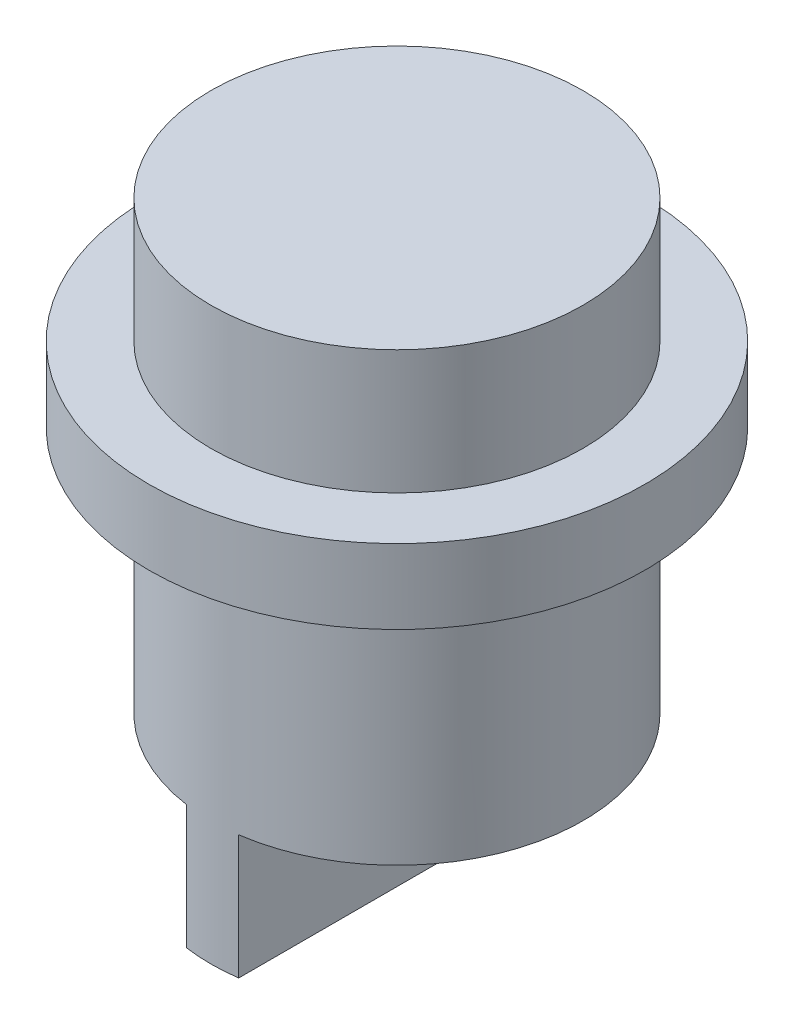
ISO-10303-21;
HEADER;
FILE_DESCRIPTION(('STEP AP214'),'2;1');
FILE_NAME('part.step','',(''),(''),'','','');
FILE_SCHEMA(('AUTOMOTIVE_DESIGN { 1 0 10303 214 1 1 1 1 }'));
ENDSEC;
DATA;
#1=APPLICATION_CONTEXT('core data for automotive mechanical design processes');
#2=APPLICATION_PROTOCOL_DEFINITION('international standard','automotive_design',2000,#1);
#3=PRODUCT_CONTEXT('',#1,'mechanical');
#4=PRODUCT('Part','Part','',(#3));
#5=PRODUCT_RELATED_PRODUCT_CATEGORY('part','',(#4));
#6=PRODUCT_DEFINITION_FORMATION('','',#4);
#7=PRODUCT_DEFINITION_CONTEXT('part definition',#1,'design');
#8=PRODUCT_DEFINITION('design','',#6,#7);
#9=PRODUCT_DEFINITION_SHAPE('','',#8);
#10=(LENGTH_UNIT() NAMED_UNIT(*) SI_UNIT(.MILLI.,.METRE.));
#11=(NAMED_UNIT(*) PLANE_ANGLE_UNIT() SI_UNIT($,.RADIAN.));
#12=(NAMED_UNIT(*) SI_UNIT($,.STERADIAN.) SOLID_ANGLE_UNIT());
#13=UNCERTAINTY_MEASURE_WITH_UNIT(LENGTH_MEASURE(1.E-05),#10,'distance_accuracy_value','');
#14=(GEOMETRIC_REPRESENTATION_CONTEXT(3) GLOBAL_UNCERTAINTY_ASSIGNED_CONTEXT((#13)) GLOBAL_UNIT_ASSIGNED_CONTEXT((#10,
#11,#12)) REPRESENTATION_CONTEXT('',''));
#15=CARTESIAN_POINT('',(0.,0.,0.));
#16=DIRECTION('',(0.,0.,1.));
#17=DIRECTION('',(1.,0.,0.));
#18=AXIS2_PLACEMENT_3D('',#15,#16,#17);
#19=CARTESIAN_POINT('',(0.,0.,0.));
#20=DIRECTION('',(0.,1.,0.));
#21=DIRECTION('',(0.,0.,1.));
#22=AXIS2_PLACEMENT_3D('',#19,#20,#21);
#23=PLANE('',#22);
#24=DIRECTION('',(0.,0.,-1.));
#25=VECTOR('',#24,1.);
#26=CARTESIAN_POINT('',(-1.04813220415567,0.,7.4264001294444));
#27=LINE('',#26,#25);
#28=CARTESIAN_POINT('',(-1.04813220415567,0.,7.4264001294444));
#29=VERTEX_POINT('',#28);
#30=CARTESIAN_POINT('',(-1.04813220415567,0.,-7.4264001294444));
#31=VERTEX_POINT('',#30);
#32=EDGE_CURVE('E56',#29,#31,#27,.T.);
#33=ORIENTED_EDGE('',*,*,#32,.F.);
#34=CARTESIAN_POINT('',(0.,0.,0.));
#35=DIRECTION('',(0.,1.,0.));
#36=DIRECTION('',(0.,0.,1.));
#37=AXIS2_PLACEMENT_3D('',#34,#35,#36);
#38=CIRCLE('',#37,7.5);
#39=EDGE_CURVE('E59',#31,#29,#38,.T.);
#40=ORIENTED_EDGE('',*,*,#39,.F.);
#41=EDGE_LOOP('',(#33,#40));
#42=FACE_BOUND('',#41,.T.);
#43=ADVANCED_FACE('F39',(#42),#23,.F.);
#44=DIRECTION('',(0.,0.,1.));
#45=VECTOR('',#44,1.);
#46=CARTESIAN_POINT('',(1.04813220415567,0.,7.4264001294444));
#47=LINE('',#46,#45);
#48=CARTESIAN_POINT('',(1.04813220415567,0.,-7.4264001294444));
#49=VERTEX_POINT('',#48);
#50=CARTESIAN_POINT('',(1.04813220415567,0.,7.4264001294444));
#51=VERTEX_POINT('',#50);
#52=EDGE_CURVE('E139',#49,#51,#47,.T.);
#53=ORIENTED_EDGE('',*,*,#52,.F.);
#54=EDGE_CURVE('E43',#51,#49,#38,.T.);
#55=ORIENTED_EDGE('',*,*,#54,.F.);
#56=EDGE_LOOP('',(#53,#55));
#57=FACE_BOUND('',#56,.T.);
#58=ADVANCED_FACE('F146',(#57),#23,.F.);
#59=CARTESIAN_POINT('',(0.,10.,0.));
#60=DIRECTION('',(0.,-1.,0.));
#61=DIRECTION('',(0.,0.,-1.));
#62=AXIS2_PLACEMENT_3D('',#59,#60,#61);
#63=CYLINDRICAL_SURFACE('',#62,7.5);
#64=CARTESIAN_POINT('',(0.,10.,0.));
#65=DIRECTION('',(0.,1.,0.));
#66=DIRECTION('',(0.,0.,1.));
#67=AXIS2_PLACEMENT_3D('',#64,#65,#66);
#68=CIRCLE('',#67,7.5);
#69=CARTESIAN_POINT('',(0.,10.,7.5));
#70=VERTEX_POINT('',#69);
#71=EDGE_CURVE('E49',#70,#70,#68,.T.);
#72=ORIENTED_EDGE('',*,*,#71,.F.);
#73=EDGE_LOOP('',(#72));
#74=FACE_BOUND('',#73,.T.);
#75=ORIENTED_EDGE('',*,*,#54,.T.);
#76=DIRECTION('',(0.,1.,0.));
#77=VECTOR('',#76,1.);
#78=CARTESIAN_POINT('',(1.04813220415567,-5.,-7.4264001294444));
#79=LINE('',#78,#77);
#80=CARTESIAN_POINT('',(1.04813220415567,-5.,-7.4264001294444));
#81=VERTEX_POINT('',#80);
#82=EDGE_CURVE('E85',#81,#49,#79,.T.);
#83=ORIENTED_EDGE('',*,*,#82,.F.);
#84=CARTESIAN_POINT('',(0.,-5.,0.));
#85=DIRECTION('',(0.,-1.,0.));
#86=DIRECTION('',(0.,0.,-1.));
#87=AXIS2_PLACEMENT_3D('',#84,#85,#86);
#88=CIRCLE('',#87,7.5);
#89=CARTESIAN_POINT('',(-1.04813220415567,-5.,-7.4264001294444));
#90=VERTEX_POINT('',#89);
#91=EDGE_CURVE('E92',#90,#81,#88,.T.);
#92=ORIENTED_EDGE('',*,*,#91,.F.);
#93=DIRECTION('',(0.,1.,0.));
#94=VECTOR('',#93,1.);
#95=CARTESIAN_POINT('',(-1.04813220415567,-5.,-7.4264001294444));
#96=LINE('',#95,#94);
#97=EDGE_CURVE('E130',#90,#31,#96,.T.);
#98=ORIENTED_EDGE('',*,*,#97,.T.);
#99=ORIENTED_EDGE('',*,*,#39,.T.);
#100=DIRECTION('',(0.,1.,0.));
#101=VECTOR('',#100,1.);
#102=CARTESIAN_POINT('',(-1.04813220415567,-5.,7.4264001294444));
#103=LINE('',#102,#101);
#104=CARTESIAN_POINT('',(-1.04813220415567,-5.,7.4264001294444));
#105=VERTEX_POINT('',#104);
#106=EDGE_CURVE('E112',#105,#29,#103,.T.);
#107=ORIENTED_EDGE('',*,*,#106,.F.);
#108=CARTESIAN_POINT('',(0.,-5.,0.));
#109=DIRECTION('',(0.,-1.,0.));
#110=DIRECTION('',(0.,0.,-1.));
#111=AXIS2_PLACEMENT_3D('',#108,#109,#110);
#112=CIRCLE('',#111,7.5);
#113=CARTESIAN_POINT('',(1.04813220415567,-5.,7.4264001294444));
#114=VERTEX_POINT('',#113);
#115=EDGE_CURVE('E91',#114,#105,#112,.T.);
#116=ORIENTED_EDGE('',*,*,#115,.F.);
#117=DIRECTION('',(0.,1.,0.));
#118=VECTOR('',#117,1.);
#119=CARTESIAN_POINT('',(1.04813220415567,-5.,7.4264001294444));
#120=LINE('',#119,#118);
#121=EDGE_CURVE('E87',#114,#51,#120,.T.);
#122=ORIENTED_EDGE('',*,*,#121,.T.);
#123=EDGE_LOOP('',(#75,#83,#92,#98,#99,#107,#116,#122));
#124=FACE_BOUND('',#123,.T.);
#125=ADVANCED_FACE('F41',(#74,#124),#63,.T.);
#126=CARTESIAN_POINT('',(0.,13.,0.));
#127=DIRECTION('',(0.,-1.,0.));
#128=DIRECTION('',(0.,0.,-1.));
#129=AXIS2_PLACEMENT_3D('',#126,#127,#128);
#130=CYLINDRICAL_SURFACE('',#129,10.);
#131=CARTESIAN_POINT('',(0.,13.,0.));
#132=DIRECTION('',(0.,1.,0.));
#133=DIRECTION('',(0.,0.,1.));
#134=AXIS2_PLACEMENT_3D('',#131,#132,#133);
#135=CIRCLE('',#134,10.);
#136=CARTESIAN_POINT('',(0.,13.,10.));
#137=VERTEX_POINT('',#136);
#138=EDGE_CURVE('E116',#137,#137,#135,.T.);
#139=ORIENTED_EDGE('',*,*,#138,.F.);
#140=EDGE_LOOP('',(#139));
#141=FACE_BOUND('',#140,.T.);
#142=CARTESIAN_POINT('',(0.,10.,0.));
#143=DIRECTION('',(0.,1.,0.));
#144=DIRECTION('',(0.,0.,1.));
#145=AXIS2_PLACEMENT_3D('',#142,#143,#144);
#146=CIRCLE('',#145,10.);
#147=CARTESIAN_POINT('',(0.,10.,10.));
#148=VERTEX_POINT('',#147);
#149=EDGE_CURVE('E110',#148,#148,#146,.T.);
#150=ORIENTED_EDGE('',*,*,#149,.T.);
#151=EDGE_LOOP('',(#150));
#152=FACE_BOUND('',#151,.T.);
#153=ADVANCED_FACE('F152',(#141,#152),#130,.T.);
#154=CARTESIAN_POINT('',(0.,13.,0.));
#155=DIRECTION('',(0.,1.,0.));
#156=DIRECTION('',(0.,0.,1.));
#157=AXIS2_PLACEMENT_3D('',#154,#155,#156);
#158=PLANE('',#157);
#159=CARTESIAN_POINT('',(0.,13.,0.));
#160=DIRECTION('',(0.,1.,0.));
#161=DIRECTION('',(0.,0.,1.));
#162=AXIS2_PLACEMENT_3D('',#159,#160,#161);
#163=CIRCLE('',#162,7.5);
#164=CARTESIAN_POINT('',(0.,13.,7.5));
#165=VERTEX_POINT('',#164);
#166=EDGE_CURVE('E11',#165,#165,#163,.T.);
#167=ORIENTED_EDGE('',*,*,#166,.F.);
#168=EDGE_LOOP('',(#167));
#169=FACE_BOUND('',#168,.T.);
#170=ORIENTED_EDGE('',*,*,#138,.T.);
#171=EDGE_LOOP('',(#170));
#172=FACE_BOUND('',#171,.T.);
#173=ADVANCED_FACE('F157',(#169,#172),#158,.T.);
#174=CARTESIAN_POINT('',(0.,10.,0.));
#175=DIRECTION('',(0.,1.,0.));
#176=DIRECTION('',(0.,0.,1.));
#177=AXIS2_PLACEMENT_3D('',#174,#175,#176);
#178=PLANE('',#177);
#179=ORIENTED_EDGE('',*,*,#71,.T.);
#180=EDGE_LOOP('',(#179));
#181=FACE_BOUND('',#180,.T.);
#182=ORIENTED_EDGE('',*,*,#149,.F.);
#183=EDGE_LOOP('',(#182));
#184=FACE_BOUND('',#183,.T.);
#185=ADVANCED_FACE('F159',(#181,#184),#178,.F.);
#186=CARTESIAN_POINT('',(0.,18.,0.));
#187=DIRECTION('',(0.,-1.,0.));
#188=DIRECTION('',(0.,0.,-1.));
#189=AXIS2_PLACEMENT_3D('',#186,#187,#188);
#190=CYLINDRICAL_SURFACE('',#189,7.5);
#191=CARTESIAN_POINT('',(0.,18.,0.));
#192=DIRECTION('',(0.,1.,0.));
#193=DIRECTION('',(0.,0.,1.));
#194=AXIS2_PLACEMENT_3D('',#191,#192,#193);
#195=CIRCLE('',#194,7.5);
#196=CARTESIAN_POINT('',(0.,18.,7.5));
#197=VERTEX_POINT('',#196);
#198=EDGE_CURVE('E105',#197,#197,#195,.T.);
#199=ORIENTED_EDGE('',*,*,#198,.F.);
#200=EDGE_LOOP('',(#199));
#201=FACE_BOUND('',#200,.T.);
#202=ORIENTED_EDGE('',*,*,#166,.T.);
#203=EDGE_LOOP('',(#202));
#204=FACE_BOUND('',#203,.T.);
#205=ADVANCED_FACE('F162',(#201,#204),#190,.T.);
#206=CARTESIAN_POINT('',(0.,18.,0.));
#207=DIRECTION('',(0.,1.,0.));
#208=DIRECTION('',(0.,0.,1.));
#209=AXIS2_PLACEMENT_3D('',#206,#207,#208);
#210=PLANE('',#209);
#211=ORIENTED_EDGE('',*,*,#198,.T.);
#212=EDGE_LOOP('',(#211));
#213=FACE_BOUND('',#212,.T.);
#214=ADVANCED_FACE('F168',(#213),#210,.T.);
#215=CARTESIAN_POINT('',(1.04813220415567,-5.,7.4264001294444));
#216=DIRECTION('',(-1.,0.,0.));
#217=DIRECTION('',(0.,0.,1.));
#218=AXIS2_PLACEMENT_3D('',#215,#216,#217);
#219=PLANE('',#218);
#220=ORIENTED_EDGE('',*,*,#52,.T.);
#221=ORIENTED_EDGE('',*,*,#121,.F.);
#222=DIRECTION('',(0.,0.,1.));
#223=VECTOR('',#222,1.);
#224=CARTESIAN_POINT('',(1.04813220415567,-5.,7.4264001294444));
#225=LINE('',#224,#223);
#226=EDGE_CURVE('E80',#81,#114,#225,.T.);
#227=ORIENTED_EDGE('',*,*,#226,.F.);
#228=ORIENTED_EDGE('',*,*,#82,.T.);
#229=EDGE_LOOP('',(#220,#221,#227,#228));
#230=FACE_BOUND('',#229,.T.);
#231=ADVANCED_FACE('F83',(#230),#219,.F.);
#232=CARTESIAN_POINT('',(-1.04813220415567,-5.,7.4264001294444));
#233=DIRECTION('',(1.,0.,0.));
#234=DIRECTION('',(0.,0.,-1.));
#235=AXIS2_PLACEMENT_3D('',#232,#233,#234);
#236=PLANE('',#235);
#237=ORIENTED_EDGE('',*,*,#32,.T.);
#238=ORIENTED_EDGE('',*,*,#97,.F.);
#239=DIRECTION('',(0.,0.,-1.));
#240=VECTOR('',#239,1.);
#241=CARTESIAN_POINT('',(-1.04813220415567,-5.,7.4264001294444));
#242=LINE('',#241,#240);
#243=EDGE_CURVE('E97',#105,#90,#242,.T.);
#244=ORIENTED_EDGE('',*,*,#243,.F.);
#245=ORIENTED_EDGE('',*,*,#106,.T.);
#246=EDGE_LOOP('',(#237,#238,#244,#245));
#247=FACE_BOUND('',#246,.T.);
#248=ADVANCED_FACE('F132',(#247),#236,.F.);
#249=CARTESIAN_POINT('',(0.,-5.,0.));
#250=DIRECTION('',(0.,-1.,0.));
#251=DIRECTION('',(0.,0.,-1.));
#252=AXIS2_PLACEMENT_3D('',#249,#250,#251);
#253=PLANE('',#252);
#254=ORIENTED_EDGE('',*,*,#91,.T.);
#255=ORIENTED_EDGE('',*,*,#226,.T.);
#256=ORIENTED_EDGE('',*,*,#115,.T.);
#257=ORIENTED_EDGE('',*,*,#243,.T.);
#258=EDGE_LOOP('',(#254,#255,#256,#257));
#259=FACE_BOUND('',#258,.T.);
#260=ADVANCED_FACE('F95',(#259),#253,.T.);
#261=CLOSED_SHELL('',(#43,#58,#125,#153,#173,#185,#205,#214,#231,#248,#260));
#262=MANIFOLD_SOLID_BREP('B2',#261);
#263=ADVANCED_BREP_SHAPE_REPRESENTATION('',(#18,#262),#14);
#264=SHAPE_DEFINITION_REPRESENTATION(#9,#263);
ENDSEC;
END-ISO-10303-21;
